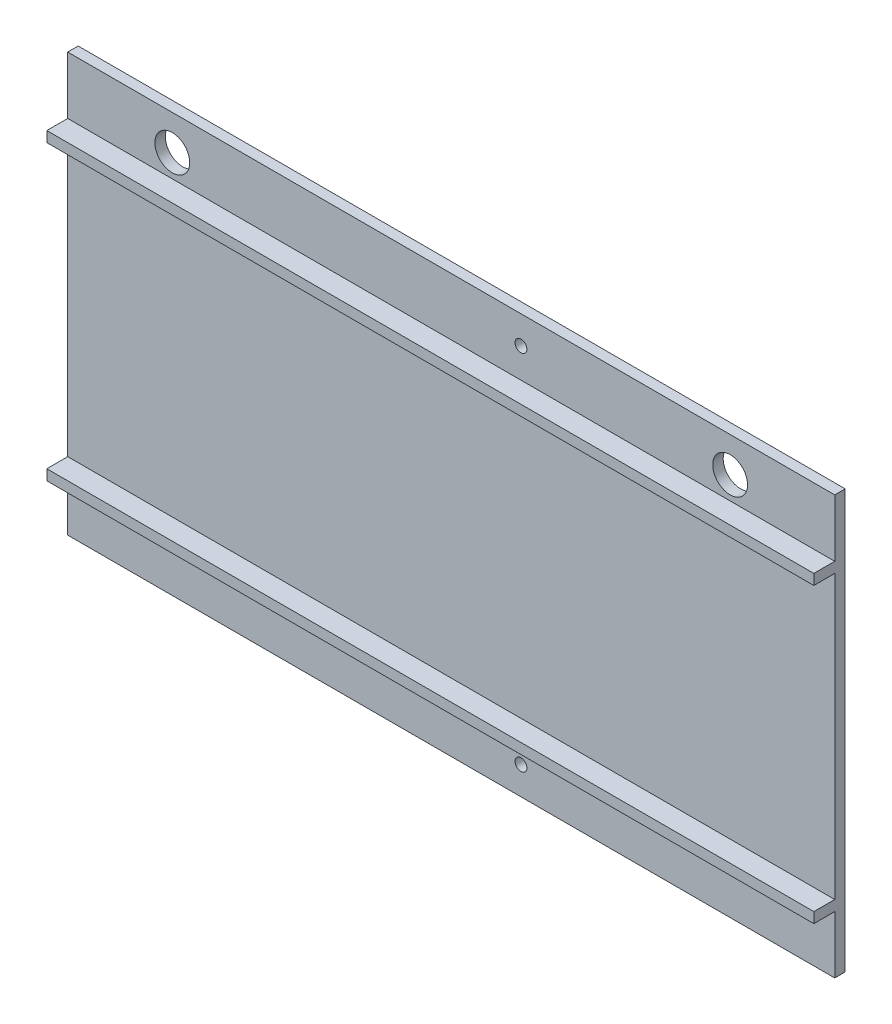
ISO-10303-21;
HEADER;
FILE_DESCRIPTION(('STEP AP214'),'2;1');
FILE_NAME('part.step','',(''),(''),'','','');
FILE_SCHEMA(('AUTOMOTIVE_DESIGN { 1 0 10303 214 1 1 1 1 }'));
ENDSEC;
DATA;
#1=APPLICATION_CONTEXT('core data for automotive mechanical design processes');
#2=APPLICATION_PROTOCOL_DEFINITION('international standard','automotive_design',2000,#1);
#3=PRODUCT_CONTEXT('',#1,'mechanical');
#4=PRODUCT('Part','Part','',(#3));
#5=PRODUCT_RELATED_PRODUCT_CATEGORY('part','',(#4));
#6=PRODUCT_DEFINITION_FORMATION('','',#4);
#7=PRODUCT_DEFINITION_CONTEXT('part definition',#1,'design');
#8=PRODUCT_DEFINITION('design','',#6,#7);
#9=PRODUCT_DEFINITION_SHAPE('','',#8);
#10=(LENGTH_UNIT() NAMED_UNIT(*) SI_UNIT(.MILLI.,.METRE.));
#11=(NAMED_UNIT(*) PLANE_ANGLE_UNIT() SI_UNIT($,.RADIAN.));
#12=(NAMED_UNIT(*) SI_UNIT($,.STERADIAN.) SOLID_ANGLE_UNIT());
#13=UNCERTAINTY_MEASURE_WITH_UNIT(LENGTH_MEASURE(1.E-05),#10,'distance_accuracy_value','');
#14=(GEOMETRIC_REPRESENTATION_CONTEXT(3) GLOBAL_UNCERTAINTY_ASSIGNED_CONTEXT((#13)) GLOBAL_UNIT_ASSIGNED_CONTEXT((#10,
#11,#12)) REPRESENTATION_CONTEXT('',''));
#15=CARTESIAN_POINT('',(0.,0.,0.));
#16=DIRECTION('',(0.,0.,1.));
#17=DIRECTION('',(1.,0.,0.));
#18=AXIS2_PLACEMENT_3D('',#15,#16,#17);
#19=CARTESIAN_POINT('',(0.,0.,43.));
#20=DIRECTION('',(0.,0.,1.));
#21=DIRECTION('',(1.,0.,0.));
#22=AXIS2_PLACEMENT_3D('',#19,#20,#21);
#23=PLANE('',#22);
#24=DIRECTION('',(1.,0.,0.));
#25=VECTOR('',#24,1.);
#26=CARTESIAN_POINT('',(0.,40.5,43.));
#27=LINE('',#26,#25);
#28=CARTESIAN_POINT('',(-110.,40.5,43.));
#29=VERTEX_POINT('',#28);
#30=CARTESIAN_POINT('',(110.,40.5,43.));
#31=VERTEX_POINT('',#30);
#32=EDGE_CURVE('E109',#29,#31,#27,.T.);
#33=ORIENTED_EDGE('',*,*,#32,.F.);
#34=DIRECTION('',(0.,1.,0.));
#35=VECTOR('',#34,1.);
#36=CARTESIAN_POINT('',(-110.,0.,43.));
#37=LINE('',#36,#35);
#38=CARTESIAN_POINT('',(-110.,-40.5,43.));
#39=VERTEX_POINT('',#38);
#40=EDGE_CURVE('E189',#39,#29,#37,.T.);
#41=ORIENTED_EDGE('',*,*,#40,.F.);
#42=DIRECTION('',(-1.,0.,0.));
#43=VECTOR('',#42,1.);
#44=CARTESIAN_POINT('',(0.,-40.5,43.));
#45=LINE('',#44,#43);
#46=CARTESIAN_POINT('',(110.,-40.5,43.));
#47=VERTEX_POINT('',#46);
#48=EDGE_CURVE('E156',#47,#39,#45,.T.);
#49=ORIENTED_EDGE('',*,*,#48,.F.);
#50=DIRECTION('',(0.,-1.,0.));
#51=VECTOR('',#50,1.);
#52=CARTESIAN_POINT('',(110.,0.,43.));
#53=LINE('',#52,#51);
#54=EDGE_CURVE('E186',#31,#47,#53,.T.);
#55=ORIENTED_EDGE('',*,*,#54,.F.);
#56=EDGE_LOOP('',(#33,#41,#49,#55));
#57=FACE_BOUND('',#56,.T.);
#58=ADVANCED_FACE('F17',(#57),#23,.T.);
#59=CARTESIAN_POINT('',(20.,-52.,43.));
#60=DIRECTION('',(0.,0.,1.));
#61=DIRECTION('',(1.,0.,0.));
#62=AXIS2_PLACEMENT_3D('',#59,#60,#61);
#63=CIRCLE('',#62,1.7);
#64=CARTESIAN_POINT('',(21.7,-52.,43.));
#65=VERTEX_POINT('',#64);
#66=EDGE_CURVE('E196',#65,#65,#63,.T.);
#67=ORIENTED_EDGE('',*,*,#66,.F.);
#68=EDGE_LOOP('',(#67));
#69=FACE_BOUND('',#68,.T.);
#70=DIRECTION('',(1.,0.,0.));
#71=VECTOR('',#70,1.);
#72=CARTESIAN_POINT('',(0.,-43.5,43.));
#73=LINE('',#72,#71);
#74=CARTESIAN_POINT('',(-110.,-43.5,43.));
#75=VERTEX_POINT('',#74);
#76=CARTESIAN_POINT('',(110.,-43.5,43.));
#77=VERTEX_POINT('',#76);
#78=EDGE_CURVE('E158',#75,#77,#73,.T.);
#79=ORIENTED_EDGE('',*,*,#78,.F.);
#80=CARTESIAN_POINT('',(-110.,-60.,43.));
#81=VERTEX_POINT('',#80);
#82=EDGE_CURVE('E27',#81,#75,#37,.T.);
#83=ORIENTED_EDGE('',*,*,#82,.F.);
#84=DIRECTION('',(-1.,0.,0.));
#85=VECTOR('',#84,1.);
#86=CARTESIAN_POINT('',(0.,-60.,43.));
#87=LINE('',#86,#85);
#88=CARTESIAN_POINT('',(110.,-60.,43.));
#89=VERTEX_POINT('',#88);
#90=EDGE_CURVE('E11',#89,#81,#87,.T.);
#91=ORIENTED_EDGE('',*,*,#90,.F.);
#92=EDGE_CURVE('E181',#77,#89,#53,.T.);
#93=ORIENTED_EDGE('',*,*,#92,.F.);
#94=EDGE_LOOP('',(#79,#83,#91,#93));
#95=FACE_BOUND('',#94,.T.);
#96=ADVANCED_FACE('F232',(#69,#95),#23,.T.);
#97=CARTESIAN_POINT('',(20.,52.,43.));
#98=DIRECTION('',(0.,0.,1.));
#99=DIRECTION('',(1.,0.,0.));
#100=AXIS2_PLACEMENT_3D('',#97,#98,#99);
#101=CIRCLE('',#100,1.7);
#102=CARTESIAN_POINT('',(21.7,52.,43.));
#103=VERTEX_POINT('',#102);
#104=EDGE_CURVE('E203',#103,#103,#101,.T.);
#105=ORIENTED_EDGE('',*,*,#104,.F.);
#106=EDGE_LOOP('',(#105));
#107=FACE_BOUND('',#106,.T.);
#108=CARTESIAN_POINT('',(80.,50.,43.));
#109=DIRECTION('',(0.,0.,1.));
#110=DIRECTION('',(1.,0.,0.));
#111=AXIS2_PLACEMENT_3D('',#108,#109,#110);
#112=CIRCLE('',#111,5.);
#113=CARTESIAN_POINT('',(85.,50.,43.));
#114=VERTEX_POINT('',#113);
#115=EDGE_CURVE('E193',#114,#114,#112,.T.);
#116=ORIENTED_EDGE('',*,*,#115,.F.);
#117=EDGE_LOOP('',(#116));
#118=FACE_BOUND('',#117,.T.);
#119=CARTESIAN_POINT('',(-80.,50.,43.));
#120=DIRECTION('',(0.,0.,1.));
#121=DIRECTION('',(1.,0.,0.));
#122=AXIS2_PLACEMENT_3D('',#119,#120,#121);
#123=CIRCLE('',#122,5.);
#124=CARTESIAN_POINT('',(-75.,50.,43.));
#125=VERTEX_POINT('',#124);
#126=EDGE_CURVE('E114',#125,#125,#123,.T.);
#127=ORIENTED_EDGE('',*,*,#126,.F.);
#128=EDGE_LOOP('',(#127));
#129=FACE_BOUND('',#128,.T.);
#130=DIRECTION('',(-1.,0.,0.));
#131=VECTOR('',#130,1.);
#132=CARTESIAN_POINT('',(0.,43.5,43.));
#133=LINE('',#132,#131);
#134=CARTESIAN_POINT('',(110.,43.5,43.));
#135=VERTEX_POINT('',#134);
#136=CARTESIAN_POINT('',(-110.,43.5,43.));
#137=VERTEX_POINT('',#136);
#138=EDGE_CURVE('E125',#135,#137,#133,.T.);
#139=ORIENTED_EDGE('',*,*,#138,.F.);
#140=CARTESIAN_POINT('',(110.,60.,43.));
#141=VERTEX_POINT('',#140);
#142=EDGE_CURVE('E183',#141,#135,#53,.T.);
#143=ORIENTED_EDGE('',*,*,#142,.F.);
#144=DIRECTION('',(1.,0.,0.));
#145=VECTOR('',#144,1.);
#146=CARTESIAN_POINT('',(0.,60.,43.));
#147=LINE('',#146,#145);
#148=CARTESIAN_POINT('',(-110.,60.,43.));
#149=VERTEX_POINT('',#148);
#150=EDGE_CURVE('E184',#149,#141,#147,.T.);
#151=ORIENTED_EDGE('',*,*,#150,.F.);
#152=EDGE_CURVE('E187',#137,#149,#37,.T.);
#153=ORIENTED_EDGE('',*,*,#152,.F.);
#154=EDGE_LOOP('',(#139,#143,#151,#153));
#155=FACE_BOUND('',#154,.T.);
#156=ADVANCED_FACE('F19',(#107,#118,#129,#155),#23,.T.);
#157=CARTESIAN_POINT('',(0.,-60.,40.));
#158=DIRECTION('',(0.,-1.,0.));
#159=DIRECTION('',(0.,0.,-1.));
#160=AXIS2_PLACEMENT_3D('',#157,#158,#159);
#161=PLANE('',#160);
#162=DIRECTION('',(0.,0.,1.));
#163=VECTOR('',#162,1.);
#164=CARTESIAN_POINT('',(110.,-60.,40.));
#165=LINE('',#164,#163);
#166=CARTESIAN_POINT('',(110.,-60.,40.));
#167=VERTEX_POINT('',#166);
#168=EDGE_CURVE('E167',#167,#89,#165,.T.);
#169=ORIENTED_EDGE('',*,*,#168,.T.);
#170=ORIENTED_EDGE('',*,*,#90,.T.);
#171=DIRECTION('',(0.,0.,1.));
#172=VECTOR('',#171,1.);
#173=CARTESIAN_POINT('',(-110.,-60.,40.));
#174=LINE('',#173,#172);
#175=CARTESIAN_POINT('',(-110.,-60.,40.));
#176=VERTEX_POINT('',#175);
#177=EDGE_CURVE('E177',#176,#81,#174,.T.);
#178=ORIENTED_EDGE('',*,*,#177,.F.);
#179=DIRECTION('',(1.,0.,0.));
#180=VECTOR('',#179,1.);
#181=CARTESIAN_POINT('',(0.,-60.,40.));
#182=LINE('',#181,#180);
#183=EDGE_CURVE('E159',#176,#167,#182,.T.);
#184=ORIENTED_EDGE('',*,*,#183,.T.);
#185=EDGE_LOOP('',(#169,#170,#178,#184));
#186=FACE_BOUND('',#185,.T.);
#187=ADVANCED_FACE('F236',(#186),#161,.T.);
#188=CARTESIAN_POINT('',(-110.,0.,40.));
#189=DIRECTION('',(-1.,0.,0.));
#190=DIRECTION('',(0.,0.,1.));
#191=AXIS2_PLACEMENT_3D('',#188,#189,#190);
#192=PLANE('',#191);
#193=DIRECTION('',(0.,-1.,0.));
#194=VECTOR('',#193,1.);
#195=CARTESIAN_POINT('',(-110.,0.,40.));
#196=LINE('',#195,#194);
#197=CARTESIAN_POINT('',(-110.,60.,40.));
#198=VERTEX_POINT('',#197);
#199=EDGE_CURVE('E162',#198,#176,#196,.T.);
#200=ORIENTED_EDGE('',*,*,#199,.T.);
#201=ORIENTED_EDGE('',*,*,#177,.T.);
#202=ORIENTED_EDGE('',*,*,#82,.T.);
#203=DIRECTION('',(0.,0.,1.));
#204=VECTOR('',#203,1.);
#205=CARTESIAN_POINT('',(-110.,-43.5,40.));
#206=LINE('',#205,#204);
#207=CARTESIAN_POINT('',(-110.,-43.5,49.));
#208=VERTEX_POINT('',#207);
#209=EDGE_CURVE('E141',#75,#208,#206,.T.);
#210=ORIENTED_EDGE('',*,*,#209,.T.);
#211=DIRECTION('',(0.,1.,0.));
#212=VECTOR('',#211,1.);
#213=CARTESIAN_POINT('',(-110.,-42.,49.));
#214=LINE('',#213,#212);
#215=CARTESIAN_POINT('',(-110.,-40.5,49.));
#216=VERTEX_POINT('',#215);
#217=EDGE_CURVE('E147',#208,#216,#214,.T.);
#218=ORIENTED_EDGE('',*,*,#217,.T.);
#219=DIRECTION('',(0.,0.,1.));
#220=VECTOR('',#219,1.);
#221=CARTESIAN_POINT('',(-110.,-40.5,40.));
#222=LINE('',#221,#220);
#223=EDGE_CURVE('E143',#39,#216,#222,.T.);
#224=ORIENTED_EDGE('',*,*,#223,.F.);
#225=ORIENTED_EDGE('',*,*,#40,.T.);
#226=DIRECTION('',(0.,0.,1.));
#227=VECTOR('',#226,1.);
#228=CARTESIAN_POINT('',(-110.,40.5,40.));
#229=LINE('',#228,#227);
#230=CARTESIAN_POINT('',(-110.,40.5,49.));
#231=VERTEX_POINT('',#230);
#232=EDGE_CURVE('E128',#29,#231,#229,.T.);
#233=ORIENTED_EDGE('',*,*,#232,.T.);
#234=DIRECTION('',(0.,1.,0.));
#235=VECTOR('',#234,1.);
#236=CARTESIAN_POINT('',(-110.,42.,49.));
#237=LINE('',#236,#235);
#238=CARTESIAN_POINT('',(-110.,43.5,49.));
#239=VERTEX_POINT('',#238);
#240=EDGE_CURVE('E121',#231,#239,#237,.T.);
#241=ORIENTED_EDGE('',*,*,#240,.T.);
#242=DIRECTION('',(0.,0.,1.));
#243=VECTOR('',#242,1.);
#244=CARTESIAN_POINT('',(-110.,43.5,40.));
#245=LINE('',#244,#243);
#246=EDGE_CURVE('E131',#137,#239,#245,.T.);
#247=ORIENTED_EDGE('',*,*,#246,.F.);
#248=ORIENTED_EDGE('',*,*,#152,.T.);
#249=DIRECTION('',(0.,0.,1.));
#250=VECTOR('',#249,1.);
#251=CARTESIAN_POINT('',(-110.,60.,40.));
#252=LINE('',#251,#250);
#253=EDGE_CURVE('E176',#198,#149,#252,.T.);
#254=ORIENTED_EDGE('',*,*,#253,.F.);
#255=EDGE_LOOP('',(#200,#201,#202,#210,#218,#224,#225,#233,#241,#247,#248,#254));
#256=FACE_BOUND('',#255,.T.);
#257=ADVANCED_FACE('F225',(#256),#192,.T.);
#258=CARTESIAN_POINT('',(0.,60.,40.));
#259=DIRECTION('',(0.,1.,0.));
#260=DIRECTION('',(0.,0.,1.));
#261=AXIS2_PLACEMENT_3D('',#258,#259,#260);
#262=PLANE('',#261);
#263=ORIENTED_EDGE('',*,*,#253,.T.);
#264=ORIENTED_EDGE('',*,*,#150,.T.);
#265=DIRECTION('',(0.,0.,1.));
#266=VECTOR('',#265,1.);
#267=CARTESIAN_POINT('',(110.,60.,40.));
#268=LINE('',#267,#266);
#269=CARTESIAN_POINT('',(110.,60.,40.));
#270=VERTEX_POINT('',#269);
#271=EDGE_CURVE('E174',#270,#141,#268,.T.);
#272=ORIENTED_EDGE('',*,*,#271,.F.);
#273=DIRECTION('',(-1.,0.,0.));
#274=VECTOR('',#273,1.);
#275=CARTESIAN_POINT('',(0.,60.,40.));
#276=LINE('',#275,#274);
#277=EDGE_CURVE('E170',#270,#198,#276,.T.);
#278=ORIENTED_EDGE('',*,*,#277,.T.);
#279=EDGE_LOOP('',(#263,#264,#272,#278));
#280=FACE_BOUND('',#279,.T.);
#281=ADVANCED_FACE('F247',(#280),#262,.T.);
#282=CARTESIAN_POINT('',(0.,0.,40.));
#283=DIRECTION('',(0.,0.,-1.));
#284=DIRECTION('',(-1.,0.,0.));
#285=AXIS2_PLACEMENT_3D('',#282,#283,#284);
#286=PLANE('',#285);
#287=CARTESIAN_POINT('',(20.,52.,40.));
#288=DIRECTION('',(0.,0.,-1.));
#289=DIRECTION('',(-1.,0.,0.));
#290=AXIS2_PLACEMENT_3D('',#287,#288,#289);
#291=CIRCLE('',#290,1.7);
#292=CARTESIAN_POINT('',(18.3,52.,40.));
#293=VERTEX_POINT('',#292);
#294=EDGE_CURVE('E21',#293,#293,#291,.T.);
#295=ORIENTED_EDGE('',*,*,#294,.F.);
#296=EDGE_LOOP('',(#295));
#297=FACE_BOUND('',#296,.T.);
#298=CARTESIAN_POINT('',(20.,-52.,40.));
#299=DIRECTION('',(0.,0.,-1.));
#300=DIRECTION('',(-1.,0.,0.));
#301=AXIS2_PLACEMENT_3D('',#298,#299,#300);
#302=CIRCLE('',#301,1.7);
#303=CARTESIAN_POINT('',(18.3,-52.,40.));
#304=VERTEX_POINT('',#303);
#305=EDGE_CURVE('E200',#304,#304,#302,.T.);
#306=ORIENTED_EDGE('',*,*,#305,.F.);
#307=EDGE_LOOP('',(#306));
#308=FACE_BOUND('',#307,.T.);
#309=CARTESIAN_POINT('',(80.,50.,40.));
#310=DIRECTION('',(0.,0.,-1.));
#311=DIRECTION('',(-1.,0.,0.));
#312=AXIS2_PLACEMENT_3D('',#309,#310,#311);
#313=CIRCLE('',#312,5.);
#314=CARTESIAN_POINT('',(75.,50.,40.));
#315=VERTEX_POINT('',#314);
#316=EDGE_CURVE('E198',#315,#315,#313,.T.);
#317=ORIENTED_EDGE('',*,*,#316,.F.);
#318=EDGE_LOOP('',(#317));
#319=FACE_BOUND('',#318,.T.);
#320=CARTESIAN_POINT('',(-80.,50.,40.));
#321=DIRECTION('',(0.,0.,-1.));
#322=DIRECTION('',(-1.,0.,0.));
#323=AXIS2_PLACEMENT_3D('',#320,#321,#322);
#324=CIRCLE('',#323,5.);
#325=CARTESIAN_POINT('',(-85.,50.,40.));
#326=VERTEX_POINT('',#325);
#327=EDGE_CURVE('E195',#326,#326,#324,.T.);
#328=ORIENTED_EDGE('',*,*,#327,.F.);
#329=EDGE_LOOP('',(#328));
#330=FACE_BOUND('',#329,.T.);
#331=ORIENTED_EDGE('',*,*,#277,.F.);
#332=DIRECTION('',(0.,1.,0.));
#333=VECTOR('',#332,1.);
#334=CARTESIAN_POINT('',(110.,0.,40.));
#335=LINE('',#334,#333);
#336=EDGE_CURVE('E163',#167,#270,#335,.T.);
#337=ORIENTED_EDGE('',*,*,#336,.F.);
#338=ORIENTED_EDGE('',*,*,#183,.F.);
#339=ORIENTED_EDGE('',*,*,#199,.F.);
#340=EDGE_LOOP('',(#331,#337,#338,#339));
#341=FACE_BOUND('',#340,.T.);
#342=ADVANCED_FACE('F242',(#297,#308,#319,#330,#341),#286,.T.);
#343=CARTESIAN_POINT('',(110.,0.,40.));
#344=DIRECTION('',(1.,0.,0.));
#345=DIRECTION('',(0.,0.,-1.));
#346=AXIS2_PLACEMENT_3D('',#343,#344,#345);
#347=PLANE('',#346);
#348=ORIENTED_EDGE('',*,*,#142,.T.);
#349=DIRECTION('',(0.,0.,1.));
#350=VECTOR('',#349,1.);
#351=CARTESIAN_POINT('',(110.,43.5,40.));
#352=LINE('',#351,#350);
#353=CARTESIAN_POINT('',(110.,43.5,49.));
#354=VERTEX_POINT('',#353);
#355=EDGE_CURVE('E115',#135,#354,#352,.T.);
#356=ORIENTED_EDGE('',*,*,#355,.T.);
#357=DIRECTION('',(0.,-1.,0.));
#358=VECTOR('',#357,1.);
#359=CARTESIAN_POINT('',(110.,42.,49.));
#360=LINE('',#359,#358);
#361=CARTESIAN_POINT('',(110.,40.5,49.));
#362=VERTEX_POINT('',#361);
#363=EDGE_CURVE('E118',#354,#362,#360,.T.);
#364=ORIENTED_EDGE('',*,*,#363,.T.);
#365=DIRECTION('',(0.,0.,1.));
#366=VECTOR('',#365,1.);
#367=CARTESIAN_POINT('',(110.,40.5,40.));
#368=LINE('',#367,#366);
#369=EDGE_CURVE('E35',#31,#362,#368,.T.);
#370=ORIENTED_EDGE('',*,*,#369,.F.);
#371=ORIENTED_EDGE('',*,*,#54,.T.);
#372=DIRECTION('',(0.,0.,1.));
#373=VECTOR('',#372,1.);
#374=CARTESIAN_POINT('',(110.,-40.5,40.));
#375=LINE('',#374,#373);
#376=CARTESIAN_POINT('',(110.,-40.5,49.));
#377=VERTEX_POINT('',#376);
#378=EDGE_CURVE('E136',#47,#377,#375,.T.);
#379=ORIENTED_EDGE('',*,*,#378,.T.);
#380=DIRECTION('',(0.,-1.,0.));
#381=VECTOR('',#380,1.);
#382=CARTESIAN_POINT('',(110.,-42.,49.));
#383=LINE('',#382,#381);
#384=CARTESIAN_POINT('',(110.,-43.5,49.));
#385=VERTEX_POINT('',#384);
#386=EDGE_CURVE('E144',#377,#385,#383,.T.);
#387=ORIENTED_EDGE('',*,*,#386,.T.);
#388=DIRECTION('',(0.,0.,1.));
#389=VECTOR('',#388,1.);
#390=CARTESIAN_POINT('',(110.,-43.5,40.));
#391=LINE('',#390,#389);
#392=EDGE_CURVE('E41',#77,#385,#391,.T.);
#393=ORIENTED_EDGE('',*,*,#392,.F.);
#394=ORIENTED_EDGE('',*,*,#92,.T.);
#395=ORIENTED_EDGE('',*,*,#168,.F.);
#396=ORIENTED_EDGE('',*,*,#336,.T.);
#397=ORIENTED_EDGE('',*,*,#271,.T.);
#398=EDGE_LOOP('',(#348,#356,#364,#370,#371,#379,#387,#393,#394,#395,#396,#397));
#399=FACE_BOUND('',#398,.T.);
#400=ADVANCED_FACE('F124',(#399),#347,.T.);
#401=CARTESIAN_POINT('',(0.,-42.,49.));
#402=DIRECTION('',(0.,0.,1.));
#403=DIRECTION('',(1.,0.,0.));
#404=AXIS2_PLACEMENT_3D('',#401,#402,#403);
#405=PLANE('',#404);
#406=DIRECTION('',(-1.,0.,0.));
#407=VECTOR('',#406,1.);
#408=CARTESIAN_POINT('',(0.,-43.5,49.));
#409=LINE('',#408,#407);
#410=EDGE_CURVE('E153',#385,#208,#409,.T.);
#411=ORIENTED_EDGE('',*,*,#410,.F.);
#412=ORIENTED_EDGE('',*,*,#386,.F.);
#413=DIRECTION('',(1.,0.,0.));
#414=VECTOR('',#413,1.);
#415=CARTESIAN_POINT('',(0.,-40.5,49.));
#416=LINE('',#415,#414);
#417=EDGE_CURVE('E150',#216,#377,#416,.T.);
#418=ORIENTED_EDGE('',*,*,#417,.F.);
#419=ORIENTED_EDGE('',*,*,#217,.F.);
#420=EDGE_LOOP('',(#411,#412,#418,#419));
#421=FACE_BOUND('',#420,.T.);
#422=ADVANCED_FACE('F260',(#421),#405,.T.);
#423=CARTESIAN_POINT('',(0.,-43.5,40.));
#424=DIRECTION('',(0.,-1.,0.));
#425=DIRECTION('',(0.,0.,-1.));
#426=AXIS2_PLACEMENT_3D('',#423,#424,#425);
#427=PLANE('',#426);
#428=ORIENTED_EDGE('',*,*,#209,.F.);
#429=ORIENTED_EDGE('',*,*,#78,.T.);
#430=ORIENTED_EDGE('',*,*,#392,.T.);
#431=ORIENTED_EDGE('',*,*,#410,.T.);
#432=EDGE_LOOP('',(#428,#429,#430,#431));
#433=FACE_BOUND('',#432,.T.);
#434=ADVANCED_FACE('F255',(#433),#427,.T.);
#435=CARTESIAN_POINT('',(0.,-40.5,40.));
#436=DIRECTION('',(0.,1.,0.));
#437=DIRECTION('',(0.,0.,1.));
#438=AXIS2_PLACEMENT_3D('',#435,#436,#437);
#439=PLANE('',#438);
#440=ORIENTED_EDGE('',*,*,#378,.F.);
#441=ORIENTED_EDGE('',*,*,#48,.T.);
#442=ORIENTED_EDGE('',*,*,#223,.T.);
#443=ORIENTED_EDGE('',*,*,#417,.T.);
#444=EDGE_LOOP('',(#440,#441,#442,#443));
#445=FACE_BOUND('',#444,.T.);
#446=ADVANCED_FACE('F259',(#445),#439,.T.);
#447=CARTESIAN_POINT('',(0.,42.,49.));
#448=DIRECTION('',(0.,0.,1.));
#449=DIRECTION('',(1.,0.,0.));
#450=AXIS2_PLACEMENT_3D('',#447,#448,#449);
#451=PLANE('',#450);
#452=DIRECTION('',(-1.,0.,0.));
#453=VECTOR('',#452,1.);
#454=CARTESIAN_POINT('',(0.,40.5,49.));
#455=LINE('',#454,#453);
#456=EDGE_CURVE('E110',#362,#231,#455,.T.);
#457=ORIENTED_EDGE('',*,*,#456,.F.);
#458=ORIENTED_EDGE('',*,*,#363,.F.);
#459=DIRECTION('',(1.,0.,0.));
#460=VECTOR('',#459,1.);
#461=CARTESIAN_POINT('',(0.,43.5,49.));
#462=LINE('',#461,#460);
#463=EDGE_CURVE('E126',#239,#354,#462,.T.);
#464=ORIENTED_EDGE('',*,*,#463,.F.);
#465=ORIENTED_EDGE('',*,*,#240,.F.);
#466=EDGE_LOOP('',(#457,#458,#464,#465));
#467=FACE_BOUND('',#466,.T.);
#468=ADVANCED_FACE('F117',(#467),#451,.T.);
#469=CARTESIAN_POINT('',(0.,40.5,40.));
#470=DIRECTION('',(0.,-1.,0.));
#471=DIRECTION('',(0.,0.,-1.));
#472=AXIS2_PLACEMENT_3D('',#469,#470,#471);
#473=PLANE('',#472);
#474=ORIENTED_EDGE('',*,*,#232,.F.);
#475=ORIENTED_EDGE('',*,*,#32,.T.);
#476=ORIENTED_EDGE('',*,*,#369,.T.);
#477=ORIENTED_EDGE('',*,*,#456,.T.);
#478=EDGE_LOOP('',(#474,#475,#476,#477));
#479=FACE_BOUND('',#478,.T.);
#480=ADVANCED_FACE('F106',(#479),#473,.T.);
#481=CARTESIAN_POINT('',(0.,43.5,40.));
#482=DIRECTION('',(0.,1.,0.));
#483=DIRECTION('',(0.,0.,1.));
#484=AXIS2_PLACEMENT_3D('',#481,#482,#483);
#485=PLANE('',#484);
#486=ORIENTED_EDGE('',*,*,#355,.F.);
#487=ORIENTED_EDGE('',*,*,#138,.T.);
#488=ORIENTED_EDGE('',*,*,#246,.T.);
#489=ORIENTED_EDGE('',*,*,#463,.T.);
#490=EDGE_LOOP('',(#486,#487,#488,#489));
#491=FACE_BOUND('',#490,.T.);
#492=ADVANCED_FACE('F217',(#491),#485,.T.);
#493=CARTESIAN_POINT('',(-80.,50.,39.));
#494=DIRECTION('',(0.,0.,1.));
#495=DIRECTION('',(1.,0.,0.));
#496=AXIS2_PLACEMENT_3D('',#493,#494,#495);
#497=CYLINDRICAL_SURFACE('',#496,5.);
#498=ORIENTED_EDGE('',*,*,#126,.T.);
#499=EDGE_LOOP('',(#498));
#500=FACE_BOUND('',#499,.T.);
#501=ORIENTED_EDGE('',*,*,#327,.T.);
#502=EDGE_LOOP('',(#501));
#503=FACE_BOUND('',#502,.T.);
#504=ADVANCED_FACE('F283',(#500,#503),#497,.F.);
#505=CARTESIAN_POINT('',(80.,50.,39.));
#506=DIRECTION('',(0.,0.,1.));
#507=DIRECTION('',(1.,0.,0.));
#508=AXIS2_PLACEMENT_3D('',#505,#506,#507);
#509=CYLINDRICAL_SURFACE('',#508,5.);
#510=ORIENTED_EDGE('',*,*,#115,.T.);
#511=EDGE_LOOP('',(#510));
#512=FACE_BOUND('',#511,.T.);
#513=ORIENTED_EDGE('',*,*,#316,.T.);
#514=EDGE_LOOP('',(#513));
#515=FACE_BOUND('',#514,.T.);
#516=ADVANCED_FACE('F290',(#512,#515),#509,.F.);
#517=CARTESIAN_POINT('',(20.,-52.,39.));
#518=DIRECTION('',(0.,0.,1.));
#519=DIRECTION('',(1.,0.,0.));
#520=AXIS2_PLACEMENT_3D('',#517,#518,#519);
#521=CYLINDRICAL_SURFACE('',#520,1.7);
#522=ORIENTED_EDGE('',*,*,#66,.T.);
#523=EDGE_LOOP('',(#522));
#524=FACE_BOUND('',#523,.T.);
#525=ORIENTED_EDGE('',*,*,#305,.T.);
#526=EDGE_LOOP('',(#525));
#527=FACE_BOUND('',#526,.T.);
#528=ADVANCED_FACE('F384',(#524,#527),#521,.F.);
#529=CARTESIAN_POINT('',(20.,52.,39.));
#530=DIRECTION('',(0.,0.,1.));
#531=DIRECTION('',(1.,0.,0.));
#532=AXIS2_PLACEMENT_3D('',#529,#530,#531);
#533=CYLINDRICAL_SURFACE('',#532,1.7);
#534=ORIENTED_EDGE('',*,*,#104,.T.);
#535=EDGE_LOOP('',(#534));
#536=FACE_BOUND('',#535,.T.);
#537=ORIENTED_EDGE('',*,*,#294,.T.);
#538=EDGE_LOOP('',(#537));
#539=FACE_BOUND('',#538,.T.);
#540=ADVANCED_FACE('F395',(#536,#539),#533,.F.);
#541=CLOSED_SHELL('',(#58,#96,#156,#187,#257,#281,#342,#400,#422,#434,#446,#468,#480,#492,#504,
#516,#528,#540));
#542=MANIFOLD_SOLID_BREP('B1',#541);
#543=ADVANCED_BREP_SHAPE_REPRESENTATION('',(#18,#542),#14);
#544=SHAPE_DEFINITION_REPRESENTATION(#9,#543);
ENDSEC;
END-ISO-10303-21;
